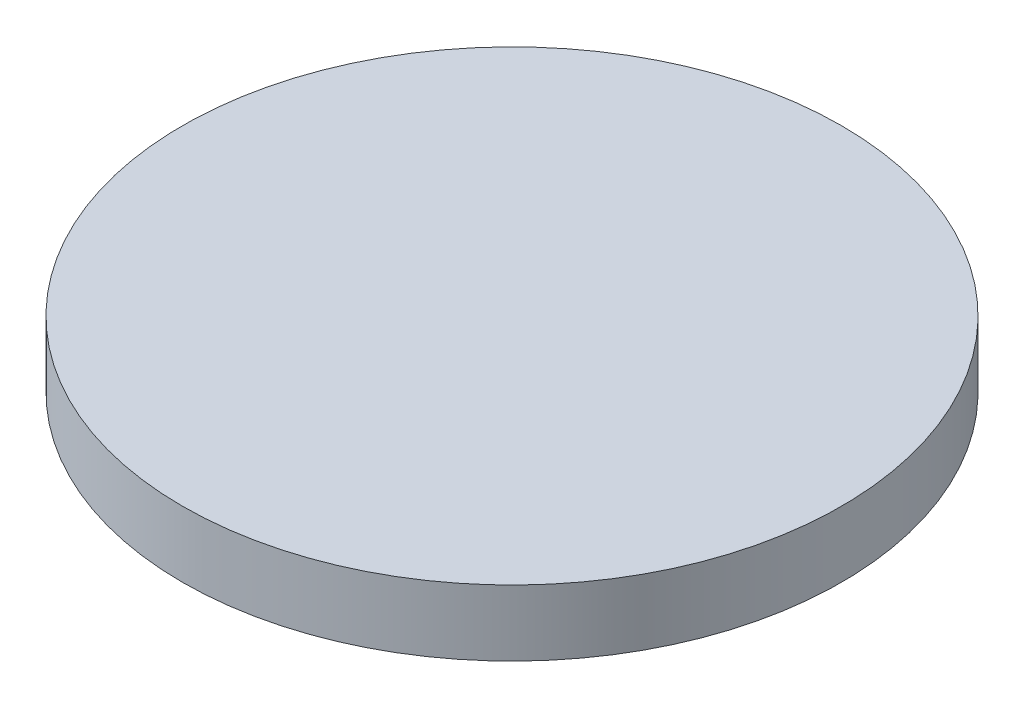
ISO-10303-21;
HEADER;
FILE_DESCRIPTION(('STEP AP214'),'2;1');
FILE_NAME('part.step','',(''),(''),'','','');
FILE_SCHEMA(('AUTOMOTIVE_DESIGN { 1 0 10303 214 1 1 1 1 }'));
ENDSEC;
DATA;
#1=APPLICATION_CONTEXT('core data for automotive mechanical design processes');
#2=APPLICATION_PROTOCOL_DEFINITION('international standard','automotive_design',2000,#1);
#3=PRODUCT_CONTEXT('',#1,'mechanical');
#4=PRODUCT('Part','Part','',(#3));
#5=PRODUCT_RELATED_PRODUCT_CATEGORY('part','',(#4));
#6=PRODUCT_DEFINITION_FORMATION('','',#4);
#7=PRODUCT_DEFINITION_CONTEXT('part definition',#1,'design');
#8=PRODUCT_DEFINITION('design','',#6,#7);
#9=PRODUCT_DEFINITION_SHAPE('','',#8);
#10=(LENGTH_UNIT() NAMED_UNIT(*) SI_UNIT(.MILLI.,.METRE.));
#11=(NAMED_UNIT(*) PLANE_ANGLE_UNIT() SI_UNIT($,.RADIAN.));
#12=(NAMED_UNIT(*) SI_UNIT($,.STERADIAN.) SOLID_ANGLE_UNIT());
#13=UNCERTAINTY_MEASURE_WITH_UNIT(LENGTH_MEASURE(1.E-05),#10,'distance_accuracy_value','');
#14=(GEOMETRIC_REPRESENTATION_CONTEXT(3) GLOBAL_UNCERTAINTY_ASSIGNED_CONTEXT((#13)) GLOBAL_UNIT_ASSIGNED_CONTEXT((#10,
#11,#12)) REPRESENTATION_CONTEXT('',''));
#15=CARTESIAN_POINT('',(0.,0.,0.));
#16=DIRECTION('',(0.,0.,1.));
#17=DIRECTION('',(1.,0.,0.));
#18=AXIS2_PLACEMENT_3D('',#15,#16,#17);
#19=CARTESIAN_POINT('',(0.,3.,0.));
#20=DIRECTION('',(0.,-1.,0.));
#21=DIRECTION('',(0.,0.,-1.));
#22=AXIS2_PLACEMENT_3D('',#19,#20,#21);
#23=CYLINDRICAL_SURFACE('',#22,15.);
#24=CARTESIAN_POINT('',(0.,3.,0.));
#25=DIRECTION('',(0.,1.,0.));
#26=DIRECTION('',(0.,0.,1.));
#27=AXIS2_PLACEMENT_3D('',#24,#25,#26);
#28=CIRCLE('',#27,15.);
#29=CARTESIAN_POINT('',(0.,3.,15.));
#30=VERTEX_POINT('',#29);
#31=EDGE_CURVE('E10',#30,#30,#28,.T.);
#32=ORIENTED_EDGE('',*,*,#31,.F.);
#33=EDGE_LOOP('',(#32));
#34=FACE_BOUND('',#33,.T.);
#35=CARTESIAN_POINT('',(0.,0.,0.));
#36=DIRECTION('',(0.,1.,0.));
#37=DIRECTION('',(0.,0.,1.));
#38=AXIS2_PLACEMENT_3D('',#35,#36,#37);
#39=CIRCLE('',#38,15.);
#40=CARTESIAN_POINT('',(0.,0.,15.));
#41=VERTEX_POINT('',#40);
#42=EDGE_CURVE('E34',#41,#41,#39,.T.);
#43=ORIENTED_EDGE('',*,*,#42,.T.);
#44=EDGE_LOOP('',(#43));
#45=FACE_BOUND('',#44,.T.);
#46=ADVANCED_FACE('F31',(#34,#45),#23,.T.);
#47=CARTESIAN_POINT('',(0.,3.,0.));
#48=DIRECTION('',(0.,1.,0.));
#49=DIRECTION('',(0.,0.,1.));
#50=AXIS2_PLACEMENT_3D('',#47,#48,#49);
#51=PLANE('',#50);
#52=ORIENTED_EDGE('',*,*,#31,.T.);
#53=EDGE_LOOP('',(#52));
#54=FACE_BOUND('',#53,.T.);
#55=ADVANCED_FACE('F46',(#54),#51,.T.);
#56=CARTESIAN_POINT('',(0.,0.,0.));
#57=DIRECTION('',(0.,1.,0.));
#58=DIRECTION('',(0.,0.,1.));
#59=AXIS2_PLACEMENT_3D('',#56,#57,#58);
#60=PLANE('',#59);
#61=ORIENTED_EDGE('',*,*,#42,.F.);
#62=EDGE_LOOP('',(#61));
#63=FACE_BOUND('',#62,.T.);
#64=ADVANCED_FACE('F44',(#63),#60,.F.);
#65=CLOSED_SHELL('',(#46,#55,#64));
#66=MANIFOLD_SOLID_BREP('B2',#65);
#67=ADVANCED_BREP_SHAPE_REPRESENTATION('',(#18,#66),#14);
#68=SHAPE_DEFINITION_REPRESENTATION(#9,#67);
ENDSEC;
END-ISO-10303-21;
